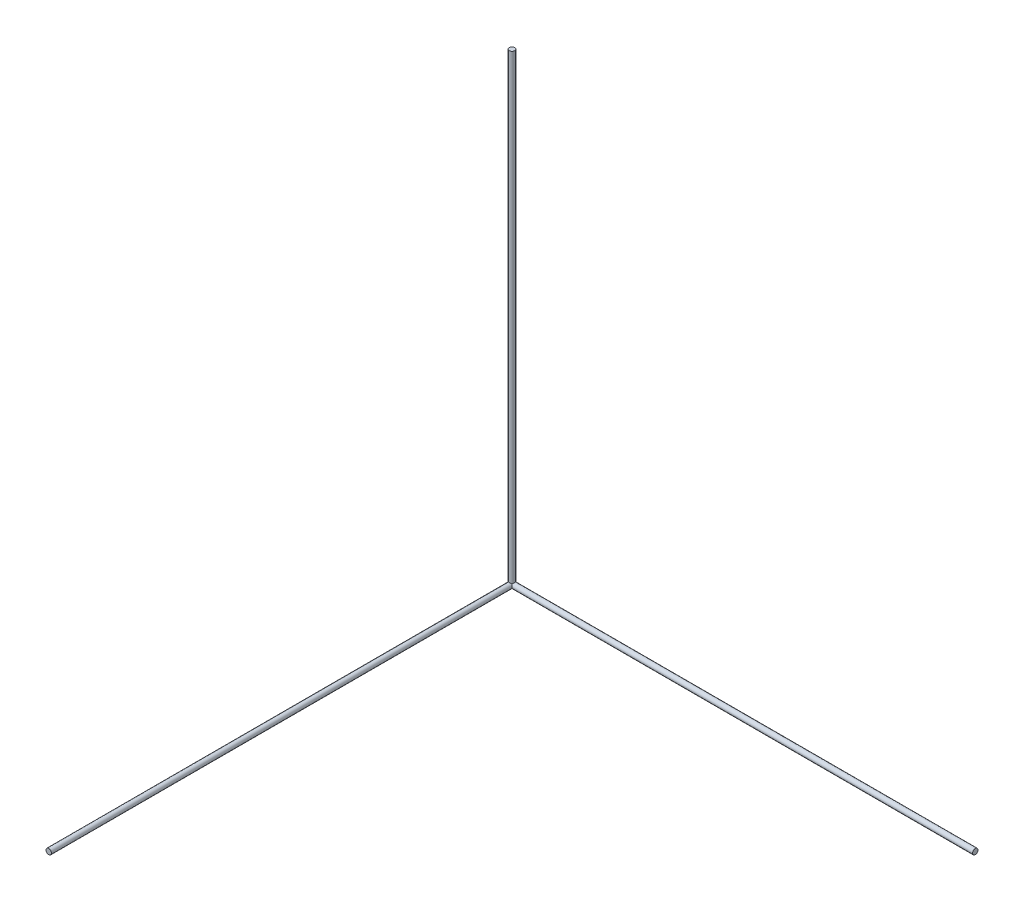
ISO-10303-21;
HEADER;
FILE_DESCRIPTION(('STEP AP214'),'2;1');
FILE_NAME('part.step','',(''),(''),'','','');
FILE_SCHEMA(('AUTOMOTIVE_DESIGN { 1 0 10303 214 1 1 1 1 }'));
ENDSEC;
DATA;
#1=APPLICATION_CONTEXT('core data for automotive mechanical design processes');
#2=APPLICATION_PROTOCOL_DEFINITION('international standard','automotive_design',2000,#1);
#3=PRODUCT_CONTEXT('',#1,'mechanical');
#4=PRODUCT('Part','Part','',(#3));
#5=PRODUCT_RELATED_PRODUCT_CATEGORY('part','',(#4));
#6=PRODUCT_DEFINITION_FORMATION('','',#4);
#7=PRODUCT_DEFINITION_CONTEXT('part definition',#1,'design');
#8=PRODUCT_DEFINITION('design','',#6,#7);
#9=PRODUCT_DEFINITION_SHAPE('','',#8);
#10=(LENGTH_UNIT() NAMED_UNIT(*) SI_UNIT(.MILLI.,.METRE.));
#11=(NAMED_UNIT(*) PLANE_ANGLE_UNIT() SI_UNIT($,.RADIAN.));
#12=(NAMED_UNIT(*) SI_UNIT($,.STERADIAN.) SOLID_ANGLE_UNIT());
#13=UNCERTAINTY_MEASURE_WITH_UNIT(LENGTH_MEASURE(1.E-05),#10,'distance_accuracy_value','');
#14=(GEOMETRIC_REPRESENTATION_CONTEXT(3) GLOBAL_UNCERTAINTY_ASSIGNED_CONTEXT((#13)) GLOBAL_UNIT_ASSIGNED_CONTEXT((#10,
#11,#12)) REPRESENTATION_CONTEXT('',''));
#15=CARTESIAN_POINT('',(0.,0.,0.));
#16=DIRECTION('',(0.,0.,1.));
#17=DIRECTION('',(1.,0.,0.));
#18=AXIS2_PLACEMENT_3D('',#15,#16,#17);
#19=CARTESIAN_POINT('',(0.,0.,300.));
#20=DIRECTION('',(0.,0.,-1.));
#21=DIRECTION('',(-1.,0.,0.));
#22=AXIS2_PLACEMENT_3D('',#19,#20,#21);
#23=CYLINDRICAL_SURFACE('',#22,1.76561711350615);
#24=CARTESIAN_POINT('',(0.,0.,300.));
#25=DIRECTION('',(0.,0.,1.));
#26=DIRECTION('',(1.,0.,0.));
#27=AXIS2_PLACEMENT_3D('',#24,#25,#26);
#28=CIRCLE('',#27,1.76561711350615);
#29=CARTESIAN_POINT('',(1.76561711350615,0.,300.));
#30=VERTEX_POINT('',#29);
#31=EDGE_CURVE('E72',#30,#30,#28,.T.);
#32=ORIENTED_EDGE('',*,*,#31,.F.);
#33=EDGE_LOOP('',(#32));
#34=FACE_BOUND('',#33,.T.);
#35=CARTESIAN_POINT('',(0.,0.,0.));
#36=DIRECTION('',(0.,0.707106781186547,-0.707106781186547));
#37=DIRECTION('',(0.,-0.707106781186547,-0.707106781186547));
#38=AXIS2_PLACEMENT_3D('',#35,#36,#37);
#39=ELLIPSE('',#38,2.49695966787843,1.76561711350615);
#40=CARTESIAN_POINT('',(-1.76561711350615,0.,0.));
#41=VERTEX_POINT('',#40);
#42=CARTESIAN_POINT('',(1.24847983393921,1.24847983393921,1.24847983393921));
#43=VERTEX_POINT('',#42);
#44=EDGE_CURVE('E49',#41,#43,#39,.T.);
#45=ORIENTED_EDGE('',*,*,#44,.F.);
#46=CARTESIAN_POINT('',(0.,0.,0.));
#47=DIRECTION('',(0.,0.,1.));
#48=DIRECTION('',(1.,0.,0.));
#49=AXIS2_PLACEMENT_3D('',#46,#47,#48);
#50=CIRCLE('',#49,1.76561711350615);
#51=CARTESIAN_POINT('',(0.,-1.76561711350615,0.));
#52=VERTEX_POINT('',#51);
#53=EDGE_CURVE('E76',#41,#52,#50,.T.);
#54=ORIENTED_EDGE('',*,*,#53,.T.);
#55=CARTESIAN_POINT('',(0.,0.,0.));
#56=DIRECTION('',(0.707106781186547,0.,-0.707106781186547));
#57=DIRECTION('',(-0.707106781186547,0.,-0.707106781186547));
#58=AXIS2_PLACEMENT_3D('',#55,#56,#57);
#59=ELLIPSE('',#58,2.49695966787843,1.76561711350615);
#60=EDGE_CURVE('E94',#43,#52,#59,.T.);
#61=ORIENTED_EDGE('',*,*,#60,.F.);
#62=EDGE_LOOP('',(#45,#54,#61));
#63=FACE_BOUND('',#62,.T.);
#64=ADVANCED_FACE('F35',(#34,#63),#23,.T.);
#65=CARTESIAN_POINT('',(0.,0.,0.));
#66=DIRECTION('',(0.,0.,1.));
#67=DIRECTION('',(1.,0.,0.));
#68=AXIS2_PLACEMENT_3D('',#65,#66,#67);
#69=PLANE('',#68);
#70=DIRECTION('',(-1.,0.,0.));
#71=VECTOR('',#70,1.);
#72=CARTESIAN_POINT('',(0.,0.,0.));
#73=LINE('',#72,#71);
#74=CARTESIAN_POINT('',(0.,0.,0.));
#75=VERTEX_POINT('',#74);
#76=EDGE_CURVE('E74',#75,#41,#73,.T.);
#77=ORIENTED_EDGE('',*,*,#76,.F.);
#78=DIRECTION('',(0.,1.,0.));
#79=VECTOR('',#78,1.);
#80=CARTESIAN_POINT('',(0.,0.,0.));
#81=LINE('',#80,#79);
#82=EDGE_CURVE('E42',#52,#75,#81,.T.);
#83=ORIENTED_EDGE('',*,*,#82,.F.);
#84=ORIENTED_EDGE('',*,*,#53,.F.);
#85=EDGE_LOOP('',(#77,#83,#84));
#86=FACE_BOUND('',#85,.T.);
#87=ADVANCED_FACE('F75',(#86),#69,.F.);
#88=CARTESIAN_POINT('',(300.,0.,0.));
#89=DIRECTION('',(-1.,0.,0.));
#90=DIRECTION('',(0.,0.,1.));
#91=AXIS2_PLACEMENT_3D('',#88,#89,#90);
#92=CYLINDRICAL_SURFACE('',#91,1.76561711350615);
#93=CARTESIAN_POINT('',(300.,0.,0.));
#94=DIRECTION('',(1.,0.,0.));
#95=DIRECTION('',(0.,0.,-1.));
#96=AXIS2_PLACEMENT_3D('',#93,#94,#95);
#97=CIRCLE('',#96,1.76561711350615);
#98=CARTESIAN_POINT('',(300.,0.,-1.76561711350615));
#99=VERTEX_POINT('',#98);
#100=EDGE_CURVE('E91',#99,#99,#97,.T.);
#101=ORIENTED_EDGE('',*,*,#100,.F.);
#102=EDGE_LOOP('',(#101));
#103=FACE_BOUND('',#102,.T.);
#104=CARTESIAN_POINT('',(0.,0.,0.));
#105=DIRECTION('',(-0.707106781186547,0.707106781186547,0.));
#106=DIRECTION('',(-0.707106781186547,-0.707106781186547,0.));
#107=AXIS2_PLACEMENT_3D('',#104,#105,#106);
#108=ELLIPSE('',#107,2.49695966787843,1.76561711350615);
#109=CARTESIAN_POINT('',(0.,0.,-1.76561711350615));
#110=VERTEX_POINT('',#109);
#111=EDGE_CURVE('E57',#43,#110,#108,.T.);
#112=ORIENTED_EDGE('',*,*,#111,.F.);
#113=ORIENTED_EDGE('',*,*,#60,.T.);
#114=CARTESIAN_POINT('',(0.,0.,0.));
#115=DIRECTION('',(1.,0.,0.));
#116=DIRECTION('',(0.,0.,-1.));
#117=AXIS2_PLACEMENT_3D('',#114,#115,#116);
#118=CIRCLE('',#117,1.76561711350615);
#119=EDGE_CURVE('E70',#52,#110,#118,.T.);
#120=ORIENTED_EDGE('',*,*,#119,.T.);
#121=EDGE_LOOP('',(#112,#113,#120));
#122=FACE_BOUND('',#121,.T.);
#123=ADVANCED_FACE('F99',(#103,#122),#92,.T.);
#124=CARTESIAN_POINT('',(0.,0.,0.));
#125=DIRECTION('',(1.,0.,0.));
#126=DIRECTION('',(0.,0.,-1.));
#127=AXIS2_PLACEMENT_3D('',#124,#125,#126);
#128=PLANE('',#127);
#129=DIRECTION('',(0.,0.,1.));
#130=VECTOR('',#129,1.);
#131=CARTESIAN_POINT('',(0.,0.,0.));
#132=LINE('',#131,#130);
#133=EDGE_CURVE('E11',#110,#75,#132,.T.);
#134=ORIENTED_EDGE('',*,*,#133,.F.);
#135=ORIENTED_EDGE('',*,*,#119,.F.);
#136=ORIENTED_EDGE('',*,*,#82,.T.);
#137=EDGE_LOOP('',(#134,#135,#136));
#138=FACE_BOUND('',#137,.T.);
#139=ADVANCED_FACE('F69',(#138),#128,.F.);
#140=CARTESIAN_POINT('',(0.,0.,300.));
#141=DIRECTION('',(0.,0.,1.));
#142=DIRECTION('',(1.,0.,0.));
#143=AXIS2_PLACEMENT_3D('',#140,#141,#142);
#144=PLANE('',#143);
#145=ORIENTED_EDGE('',*,*,#31,.T.);
#146=EDGE_LOOP('',(#145));
#147=FACE_BOUND('',#146,.T.);
#148=ADVANCED_FACE('F111',(#147),#144,.T.);
#149=CARTESIAN_POINT('',(300.,0.,0.));
#150=DIRECTION('',(1.,0.,0.));
#151=DIRECTION('',(0.,0.,-1.));
#152=AXIS2_PLACEMENT_3D('',#149,#150,#151);
#153=PLANE('',#152);
#154=ORIENTED_EDGE('',*,*,#100,.T.);
#155=EDGE_LOOP('',(#154));
#156=FACE_BOUND('',#155,.T.);
#157=ADVANCED_FACE('F102',(#156),#153,.T.);
#158=CARTESIAN_POINT('',(0.,300.,0.));
#159=DIRECTION('',(0.,-1.,0.));
#160=DIRECTION('',(0.,0.,-1.));
#161=AXIS2_PLACEMENT_3D('',#158,#159,#160);
#162=CYLINDRICAL_SURFACE('',#161,1.76561711350615);
#163=CARTESIAN_POINT('',(0.,300.,0.));
#164=DIRECTION('',(0.,1.,0.));
#165=DIRECTION('',(0.,0.,1.));
#166=AXIS2_PLACEMENT_3D('',#163,#164,#165);
#167=CIRCLE('',#166,1.76561711350615);
#168=CARTESIAN_POINT('',(0.,300.,1.76561711350615));
#169=VERTEX_POINT('',#168);
#170=EDGE_CURVE('E80',#169,#169,#167,.T.);
#171=ORIENTED_EDGE('',*,*,#170,.F.);
#172=EDGE_LOOP('',(#171));
#173=FACE_BOUND('',#172,.T.);
#174=CARTESIAN_POINT('',(0.,0.,0.));
#175=DIRECTION('',(0.,1.,0.));
#176=DIRECTION('',(0.,0.,1.));
#177=AXIS2_PLACEMENT_3D('',#174,#175,#176);
#178=CIRCLE('',#177,1.76561711350615);
#179=EDGE_CURVE('E83',#110,#41,#178,.T.);
#180=ORIENTED_EDGE('',*,*,#179,.T.);
#181=ORIENTED_EDGE('',*,*,#44,.T.);
#182=ORIENTED_EDGE('',*,*,#111,.T.);
#183=EDGE_LOOP('',(#180,#181,#182));
#184=FACE_BOUND('',#183,.T.);
#185=ADVANCED_FACE('F100',(#173,#184),#162,.T.);
#186=CARTESIAN_POINT('',(0.,0.,0.));
#187=DIRECTION('',(0.,1.,0.));
#188=DIRECTION('',(0.,0.,1.));
#189=AXIS2_PLACEMENT_3D('',#186,#187,#188);
#190=PLANE('',#189);
#191=ORIENTED_EDGE('',*,*,#133,.T.);
#192=ORIENTED_EDGE('',*,*,#76,.T.);
#193=ORIENTED_EDGE('',*,*,#179,.F.);
#194=EDGE_LOOP('',(#191,#192,#193));
#195=FACE_BOUND('',#194,.T.);
#196=ADVANCED_FACE('F82',(#195),#190,.F.);
#197=CARTESIAN_POINT('',(0.,300.,0.));
#198=DIRECTION('',(0.,1.,0.));
#199=DIRECTION('',(0.,0.,1.));
#200=AXIS2_PLACEMENT_3D('',#197,#198,#199);
#201=PLANE('',#200);
#202=ORIENTED_EDGE('',*,*,#170,.T.);
#203=EDGE_LOOP('',(#202));
#204=FACE_BOUND('',#203,.T.);
#205=ADVANCED_FACE('F109',(#204),#201,.T.);
#206=CLOSED_SHELL('',(#64,#87,#123,#139,#148,#157,#185,#196,#205));
#207=MANIFOLD_SOLID_BREP('B2',#206);
#208=ADVANCED_BREP_SHAPE_REPRESENTATION('',(#18,#207),#14);
#209=SHAPE_DEFINITION_REPRESENTATION(#9,#208);
ENDSEC;
END-ISO-10303-21;
